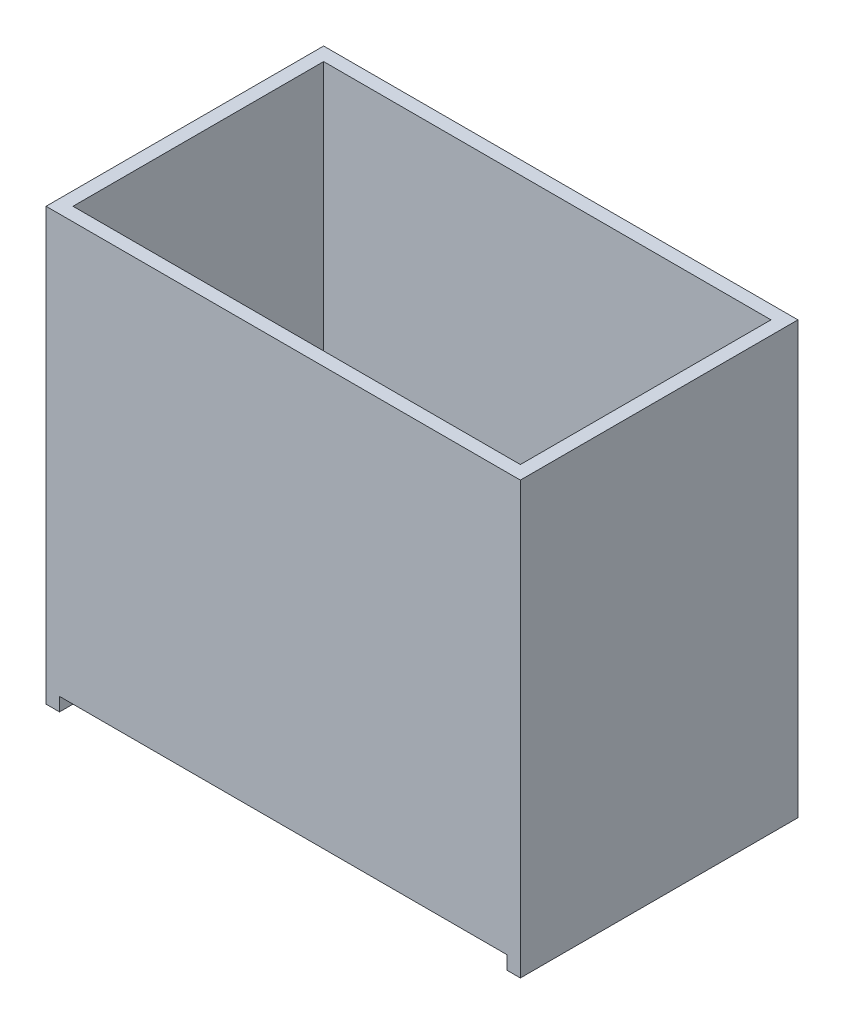
ISO-10303-21;
HEADER;
FILE_DESCRIPTION(('STEP AP214'),'2;1');
FILE_NAME('part.step','',(''),(''),'','','');
FILE_SCHEMA(('AUTOMOTIVE_DESIGN { 1 0 10303 214 1 1 1 1 }'));
ENDSEC;
DATA;
#1=APPLICATION_CONTEXT('core data for automotive mechanical design processes');
#2=APPLICATION_PROTOCOL_DEFINITION('international standard','automotive_design',2000,#1);
#3=PRODUCT_CONTEXT('',#1,'mechanical');
#4=PRODUCT('Part','Part','',(#3));
#5=PRODUCT_RELATED_PRODUCT_CATEGORY('part','',(#4));
#6=PRODUCT_DEFINITION_FORMATION('','',#4);
#7=PRODUCT_DEFINITION_CONTEXT('part definition',#1,'design');
#8=PRODUCT_DEFINITION('design','',#6,#7);
#9=PRODUCT_DEFINITION_SHAPE('','',#8);
#10=(LENGTH_UNIT() NAMED_UNIT(*) SI_UNIT(.MILLI.,.METRE.));
#11=(NAMED_UNIT(*) PLANE_ANGLE_UNIT() SI_UNIT($,.RADIAN.));
#12=(NAMED_UNIT(*) SI_UNIT($,.STERADIAN.) SOLID_ANGLE_UNIT());
#13=UNCERTAINTY_MEASURE_WITH_UNIT(LENGTH_MEASURE(1.E-05),#10,'distance_accuracy_value','');
#14=(GEOMETRIC_REPRESENTATION_CONTEXT(3) GLOBAL_UNCERTAINTY_ASSIGNED_CONTEXT((#13)) GLOBAL_UNIT_ASSIGNED_CONTEXT((#10,
#11,#12)) REPRESENTATION_CONTEXT('',''));
#15=CARTESIAN_POINT('',(0.,0.,0.));
#16=DIRECTION('',(0.,0.,1.));
#17=DIRECTION('',(1.,0.,0.));
#18=AXIS2_PLACEMENT_3D('',#15,#16,#17);
#19=CARTESIAN_POINT('',(0.,160.,0.));
#20=DIRECTION('',(0.,-1.,0.));
#21=DIRECTION('',(0.,0.,-1.));
#22=AXIS2_PLACEMENT_3D('',#19,#20,#21);
#23=PLANE('',#22);
#24=DIRECTION('',(0.,0.,1.));
#25=VECTOR('',#24,1.);
#26=CARTESIAN_POINT('',(0.,160.,0.));
#27=LINE('',#26,#25);
#28=CARTESIAN_POINT('',(0.,160.,-103.));
#29=VERTEX_POINT('',#28);
#30=CARTESIAN_POINT('',(0.,160.,0.));
#31=VERTEX_POINT('',#30);
#32=EDGE_CURVE('E172',#29,#31,#27,.T.);
#33=ORIENTED_EDGE('',*,*,#32,.T.);
#34=DIRECTION('',(1.,0.,0.));
#35=VECTOR('',#34,1.);
#36=CARTESIAN_POINT('',(0.,160.,0.));
#37=LINE('',#36,#35);
#38=CARTESIAN_POINT('',(176.,160.,0.));
#39=VERTEX_POINT('',#38);
#40=EDGE_CURVE('E175',#31,#39,#37,.T.);
#41=ORIENTED_EDGE('',*,*,#40,.T.);
#42=DIRECTION('',(0.,0.,-1.));
#43=VECTOR('',#42,1.);
#44=CARTESIAN_POINT('',(176.,160.,0.));
#45=LINE('',#44,#43);
#46=CARTESIAN_POINT('',(176.,160.,-103.));
#47=VERTEX_POINT('',#46);
#48=EDGE_CURVE('E178',#39,#47,#45,.T.);
#49=ORIENTED_EDGE('',*,*,#48,.T.);
#50=DIRECTION('',(-1.,0.,0.));
#51=VECTOR('',#50,1.);
#52=CARTESIAN_POINT('',(0.,160.,-103.));
#53=LINE('',#52,#51);
#54=EDGE_CURVE('E180',#47,#29,#53,.T.);
#55=ORIENTED_EDGE('',*,*,#54,.T.);
#56=EDGE_LOOP('',(#33,#41,#49,#55));
#57=FACE_BOUND('',#56,.T.);
#58=DIRECTION('',(0.,0.,1.));
#59=VECTOR('',#58,1.);
#60=CARTESIAN_POINT('',(5.,160.,-5.));
#61=LINE('',#60,#59);
#62=CARTESIAN_POINT('',(5.,160.,-98.));
#63=VERTEX_POINT('',#62);
#64=CARTESIAN_POINT('',(5.,160.,-5.));
#65=VERTEX_POINT('',#64);
#66=EDGE_CURVE('E148',#63,#65,#61,.T.);
#67=ORIENTED_EDGE('',*,*,#66,.F.);
#68=DIRECTION('',(-1.,0.,0.));
#69=VECTOR('',#68,1.);
#70=CARTESIAN_POINT('',(5.,160.,-98.));
#71=LINE('',#70,#69);
#72=CARTESIAN_POINT('',(171.,160.,-98.));
#73=VERTEX_POINT('',#72);
#74=EDGE_CURVE('E155',#73,#63,#71,.T.);
#75=ORIENTED_EDGE('',*,*,#74,.F.);
#76=DIRECTION('',(0.,0.,-1.));
#77=VECTOR('',#76,1.);
#78=CARTESIAN_POINT('',(171.,160.,-5.));
#79=LINE('',#78,#77);
#80=CARTESIAN_POINT('',(171.,160.,-5.));
#81=VERTEX_POINT('',#80);
#82=EDGE_CURVE('E153',#81,#73,#79,.T.);
#83=ORIENTED_EDGE('',*,*,#82,.F.);
#84=DIRECTION('',(1.,0.,0.));
#85=VECTOR('',#84,1.);
#86=CARTESIAN_POINT('',(5.,160.,-5.));
#87=LINE('',#86,#85);
#88=EDGE_CURVE('E150',#65,#81,#87,.T.);
#89=ORIENTED_EDGE('',*,*,#88,.F.);
#90=EDGE_LOOP('',(#67,#75,#83,#89));
#91=FACE_BOUND('',#90,.T.);
#92=ADVANCED_FACE('F43',(#57,#91),#23,.F.);
#93=CARTESIAN_POINT('',(0.,0.,0.));
#94=DIRECTION('',(0.,-1.,0.));
#95=DIRECTION('',(0.,0.,-1.));
#96=AXIS2_PLACEMENT_3D('',#93,#94,#95);
#97=PLANE('',#96);
#98=DIRECTION('',(0.,0.,1.));
#99=VECTOR('',#98,1.);
#100=CARTESIAN_POINT('',(5.,0.,-5.));
#101=LINE('',#100,#99);
#102=CARTESIAN_POINT('',(5.,0.,-98.));
#103=VERTEX_POINT('',#102);
#104=CARTESIAN_POINT('',(5.,0.,0.));
#105=VERTEX_POINT('',#104);
#106=EDGE_CURVE('E138',#103,#105,#101,.T.);
#107=ORIENTED_EDGE('',*,*,#106,.T.);
#108=DIRECTION('',(1.,0.,0.));
#109=VECTOR('',#108,1.);
#110=CARTESIAN_POINT('',(0.,0.,0.));
#111=LINE('',#110,#109);
#112=CARTESIAN_POINT('',(0.,0.,0.));
#113=VERTEX_POINT('',#112);
#114=EDGE_CURVE('E142',#113,#105,#111,.T.);
#115=ORIENTED_EDGE('',*,*,#114,.F.);
#116=DIRECTION('',(0.,0.,1.));
#117=VECTOR('',#116,1.);
#118=CARTESIAN_POINT('',(0.,0.,0.));
#119=LINE('',#118,#117);
#120=CARTESIAN_POINT('',(0.,0.,-103.));
#121=VERTEX_POINT('',#120);
#122=EDGE_CURVE('E171',#121,#113,#119,.T.);
#123=ORIENTED_EDGE('',*,*,#122,.F.);
#124=DIRECTION('',(-1.,0.,0.));
#125=VECTOR('',#124,1.);
#126=CARTESIAN_POINT('',(0.,0.,-103.));
#127=LINE('',#126,#125);
#128=CARTESIAN_POINT('',(176.,0.,-103.));
#129=VERTEX_POINT('',#128);
#130=EDGE_CURVE('E176',#129,#121,#127,.T.);
#131=ORIENTED_EDGE('',*,*,#130,.F.);
#132=DIRECTION('',(0.,0.,-1.));
#133=VECTOR('',#132,1.);
#134=CARTESIAN_POINT('',(176.,0.,0.));
#135=LINE('',#134,#133);
#136=CARTESIAN_POINT('',(176.,0.,0.));
#137=VERTEX_POINT('',#136);
#138=EDGE_CURVE('E187',#137,#129,#135,.T.);
#139=ORIENTED_EDGE('',*,*,#138,.F.);
#140=CARTESIAN_POINT('',(171.,0.,0.));
#141=VERTEX_POINT('',#140);
#142=EDGE_CURVE('E185',#141,#137,#111,.T.);
#143=ORIENTED_EDGE('',*,*,#142,.F.);
#144=DIRECTION('',(0.,0.,-1.));
#145=VECTOR('',#144,1.);
#146=CARTESIAN_POINT('',(171.,0.,-5.));
#147=LINE('',#146,#145);
#148=CARTESIAN_POINT('',(171.,0.,-98.));
#149=VERTEX_POINT('',#148);
#150=EDGE_CURVE('E159',#141,#149,#147,.T.);
#151=ORIENTED_EDGE('',*,*,#150,.T.);
#152=DIRECTION('',(-1.,0.,0.));
#153=VECTOR('',#152,1.);
#154=CARTESIAN_POINT('',(5.,0.,-98.));
#155=LINE('',#154,#153);
#156=EDGE_CURVE('E151',#149,#103,#155,.T.);
#157=ORIENTED_EDGE('',*,*,#156,.T.);
#158=EDGE_LOOP('',(#107,#115,#123,#131,#139,#143,#151,#157));
#159=FACE_BOUND('',#158,.T.);
#160=ADVANCED_FACE('F204',(#159),#97,.T.);
#161=CARTESIAN_POINT('',(0.,160.,0.));
#162=DIRECTION('',(1.,0.,0.));
#163=DIRECTION('',(0.,0.,-1.));
#164=AXIS2_PLACEMENT_3D('',#161,#162,#163);
#165=PLANE('',#164);
#166=ORIENTED_EDGE('',*,*,#122,.T.);
#167=DIRECTION('',(0.,-1.,0.));
#168=VECTOR('',#167,1.);
#169=CARTESIAN_POINT('',(0.,160.,0.));
#170=LINE('',#169,#168);
#171=EDGE_CURVE('E11',#31,#113,#170,.T.);
#172=ORIENTED_EDGE('',*,*,#171,.F.);
#173=ORIENTED_EDGE('',*,*,#32,.F.);
#174=DIRECTION('',(0.,-1.,0.));
#175=VECTOR('',#174,1.);
#176=CARTESIAN_POINT('',(0.,160.,-103.));
#177=LINE('',#176,#175);
#178=EDGE_CURVE('E182',#29,#121,#177,.T.);
#179=ORIENTED_EDGE('',*,*,#178,.T.);
#180=EDGE_LOOP('',(#166,#172,#173,#179));
#181=FACE_BOUND('',#180,.T.);
#182=ADVANCED_FACE('F45',(#181),#165,.F.);
#183=CARTESIAN_POINT('',(0.,160.,0.));
#184=DIRECTION('',(0.,0.,-1.));
#185=DIRECTION('',(-1.,0.,0.));
#186=AXIS2_PLACEMENT_3D('',#183,#184,#185);
#187=PLANE('',#186);
#188=ORIENTED_EDGE('',*,*,#114,.T.);
#189=DIRECTION('',(0.,-1.,0.));
#190=VECTOR('',#189,1.);
#191=CARTESIAN_POINT('',(5.,0.,0.));
#192=LINE('',#191,#190);
#193=CARTESIAN_POINT('',(5.,5.,0.));
#194=VERTEX_POINT('',#193);
#195=EDGE_CURVE('E125',#194,#105,#192,.T.);
#196=ORIENTED_EDGE('',*,*,#195,.F.);
#197=DIRECTION('',(-1.,0.,0.));
#198=VECTOR('',#197,1.);
#199=CARTESIAN_POINT('',(5.,5.,0.));
#200=LINE('',#199,#198);
#201=CARTESIAN_POINT('',(171.,5.,0.));
#202=VERTEX_POINT('',#201);
#203=EDGE_CURVE('E134',#202,#194,#200,.T.);
#204=ORIENTED_EDGE('',*,*,#203,.F.);
#205=DIRECTION('',(0.,1.,0.));
#206=VECTOR('',#205,1.);
#207=CARTESIAN_POINT('',(171.,0.,0.));
#208=LINE('',#207,#206);
#209=EDGE_CURVE('E139',#141,#202,#208,.T.);
#210=ORIENTED_EDGE('',*,*,#209,.F.);
#211=ORIENTED_EDGE('',*,*,#142,.T.);
#212=DIRECTION('',(0.,-1.,0.));
#213=VECTOR('',#212,1.);
#214=CARTESIAN_POINT('',(176.,160.,0.));
#215=LINE('',#214,#213);
#216=EDGE_CURVE('E51',#39,#137,#215,.T.);
#217=ORIENTED_EDGE('',*,*,#216,.F.);
#218=ORIENTED_EDGE('',*,*,#40,.F.);
#219=ORIENTED_EDGE('',*,*,#171,.T.);
#220=EDGE_LOOP('',(#188,#196,#204,#210,#211,#217,#218,#219));
#221=FACE_BOUND('',#220,.T.);
#222=ADVANCED_FACE('F141',(#221),#187,.F.);
#223=CARTESIAN_POINT('',(176.,160.,0.));
#224=DIRECTION('',(-1.,0.,0.));
#225=DIRECTION('',(0.,0.,1.));
#226=AXIS2_PLACEMENT_3D('',#223,#224,#225);
#227=PLANE('',#226);
#228=ORIENTED_EDGE('',*,*,#138,.T.);
#229=DIRECTION('',(0.,-1.,0.));
#230=VECTOR('',#229,1.);
#231=CARTESIAN_POINT('',(176.,160.,-103.));
#232=LINE('',#231,#230);
#233=EDGE_CURVE('E192',#47,#129,#232,.T.);
#234=ORIENTED_EDGE('',*,*,#233,.F.);
#235=ORIENTED_EDGE('',*,*,#48,.F.);
#236=ORIENTED_EDGE('',*,*,#216,.T.);
#237=EDGE_LOOP('',(#228,#234,#235,#236));
#238=FACE_BOUND('',#237,.T.);
#239=ADVANCED_FACE('F199',(#238),#227,.F.);
#240=CARTESIAN_POINT('',(0.,160.,-103.));
#241=DIRECTION('',(0.,0.,1.));
#242=DIRECTION('',(1.,0.,0.));
#243=AXIS2_PLACEMENT_3D('',#240,#241,#242);
#244=PLANE('',#243);
#245=ORIENTED_EDGE('',*,*,#130,.T.);
#246=ORIENTED_EDGE('',*,*,#178,.F.);
#247=ORIENTED_EDGE('',*,*,#54,.F.);
#248=ORIENTED_EDGE('',*,*,#233,.T.);
#249=EDGE_LOOP('',(#245,#246,#247,#248));
#250=FACE_BOUND('',#249,.T.);
#251=ADVANCED_FACE('F208',(#250),#244,.F.);
#252=CARTESIAN_POINT('',(5.,160.,-5.));
#253=DIRECTION('',(1.,0.,0.));
#254=DIRECTION('',(0.,0.,-1.));
#255=AXIS2_PLACEMENT_3D('',#252,#253,#254);
#256=PLANE('',#255);
#257=ORIENTED_EDGE('',*,*,#106,.F.);
#258=DIRECTION('',(0.,-1.,0.));
#259=VECTOR('',#258,1.);
#260=CARTESIAN_POINT('',(5.,160.,-98.));
#261=LINE('',#260,#259);
#262=EDGE_CURVE('E157',#63,#103,#261,.T.);
#263=ORIENTED_EDGE('',*,*,#262,.F.);
#264=ORIENTED_EDGE('',*,*,#66,.T.);
#265=DIRECTION('',(0.,-1.,0.));
#266=VECTOR('',#265,1.);
#267=CARTESIAN_POINT('',(5.,160.,-5.));
#268=LINE('',#267,#266);
#269=CARTESIAN_POINT('',(5.,5.,-5.));
#270=VERTEX_POINT('',#269);
#271=EDGE_CURVE('E128',#65,#270,#268,.T.);
#272=ORIENTED_EDGE('',*,*,#271,.T.);
#273=DIRECTION('',(0.,0.,1.));
#274=VECTOR('',#273,1.);
#275=CARTESIAN_POINT('',(5.,5.,-103.001));
#276=LINE('',#275,#274);
#277=EDGE_CURVE('E121',#270,#194,#276,.T.);
#278=ORIENTED_EDGE('',*,*,#277,.T.);
#279=ORIENTED_EDGE('',*,*,#195,.T.);
#280=EDGE_LOOP('',(#257,#263,#264,#272,#278,#279));
#281=FACE_BOUND('',#280,.T.);
#282=ADVANCED_FACE('F123',(#281),#256,.T.);
#283=CARTESIAN_POINT('',(5.,160.,-5.));
#284=DIRECTION('',(0.,0.,-1.));
#285=DIRECTION('',(-1.,0.,0.));
#286=AXIS2_PLACEMENT_3D('',#283,#284,#285);
#287=PLANE('',#286);
#288=DIRECTION('',(-1.,0.,0.));
#289=VECTOR('',#288,1.);
#290=CARTESIAN_POINT('',(5.,5.,-5.));
#291=LINE('',#290,#289);
#292=CARTESIAN_POINT('',(171.,5.,-5.));
#293=VERTEX_POINT('',#292);
#294=EDGE_CURVE('E131',#293,#270,#291,.T.);
#295=ORIENTED_EDGE('',*,*,#294,.T.);
#296=ORIENTED_EDGE('',*,*,#271,.F.);
#297=ORIENTED_EDGE('',*,*,#88,.T.);
#298=DIRECTION('',(0.,-1.,0.));
#299=VECTOR('',#298,1.);
#300=CARTESIAN_POINT('',(171.,160.,-5.));
#301=LINE('',#300,#299);
#302=EDGE_CURVE('E167',#81,#293,#301,.T.);
#303=ORIENTED_EDGE('',*,*,#302,.T.);
#304=EDGE_LOOP('',(#295,#296,#297,#303));
#305=FACE_BOUND('',#304,.T.);
#306=ADVANCED_FACE('F223',(#305),#287,.T.);
#307=CARTESIAN_POINT('',(171.,160.,-5.));
#308=DIRECTION('',(-1.,0.,0.));
#309=DIRECTION('',(0.,0.,1.));
#310=AXIS2_PLACEMENT_3D('',#307,#308,#309);
#311=PLANE('',#310);
#312=ORIENTED_EDGE('',*,*,#150,.F.);
#313=ORIENTED_EDGE('',*,*,#209,.T.);
#314=DIRECTION('',(0.,0.,1.));
#315=VECTOR('',#314,1.);
#316=CARTESIAN_POINT('',(171.,5.,-103.001));
#317=LINE('',#316,#315);
#318=EDGE_CURVE('E58',#293,#202,#317,.T.);
#319=ORIENTED_EDGE('',*,*,#318,.F.);
#320=ORIENTED_EDGE('',*,*,#302,.F.);
#321=ORIENTED_EDGE('',*,*,#82,.T.);
#322=DIRECTION('',(0.,-1.,0.));
#323=VECTOR('',#322,1.);
#324=CARTESIAN_POINT('',(171.,160.,-98.));
#325=LINE('',#324,#323);
#326=EDGE_CURVE('E66',#73,#149,#325,.T.);
#327=ORIENTED_EDGE('',*,*,#326,.T.);
#328=EDGE_LOOP('',(#312,#313,#319,#320,#321,#327));
#329=FACE_BOUND('',#328,.T.);
#330=ADVANCED_FACE('F224',(#329),#311,.T.);
#331=CARTESIAN_POINT('',(5.,160.,-98.));
#332=DIRECTION('',(0.,0.,1.));
#333=DIRECTION('',(1.,0.,0.));
#334=AXIS2_PLACEMENT_3D('',#331,#332,#333);
#335=PLANE('',#334);
#336=ORIENTED_EDGE('',*,*,#156,.F.);
#337=ORIENTED_EDGE('',*,*,#326,.F.);
#338=ORIENTED_EDGE('',*,*,#74,.T.);
#339=ORIENTED_EDGE('',*,*,#262,.T.);
#340=EDGE_LOOP('',(#336,#337,#338,#339));
#341=FACE_BOUND('',#340,.T.);
#342=ADVANCED_FACE('F225',(#341),#335,.T.);
#343=CARTESIAN_POINT('',(5.,5.,-103.001));
#344=DIRECTION('',(0.,1.,0.));
#345=DIRECTION('',(0.,0.,1.));
#346=AXIS2_PLACEMENT_3D('',#343,#344,#345);
#347=PLANE('',#346);
#348=ORIENTED_EDGE('',*,*,#318,.T.);
#349=ORIENTED_EDGE('',*,*,#203,.T.);
#350=ORIENTED_EDGE('',*,*,#277,.F.);
#351=ORIENTED_EDGE('',*,*,#294,.F.);
#352=EDGE_LOOP('',(#348,#349,#350,#351));
#353=FACE_BOUND('',#352,.T.);
#354=ADVANCED_FACE('F135',(#353),#347,.F.);
#355=CLOSED_SHELL('',(#92,#160,#182,#222,#239,#251,#282,#306,#330,#342,#354));
#356=MANIFOLD_SOLID_BREP('B2',#355);
#357=ADVANCED_BREP_SHAPE_REPRESENTATION('',(#18,#356),#14);
#358=SHAPE_DEFINITION_REPRESENTATION(#9,#357);
ENDSEC;
END-ISO-10303-21;
